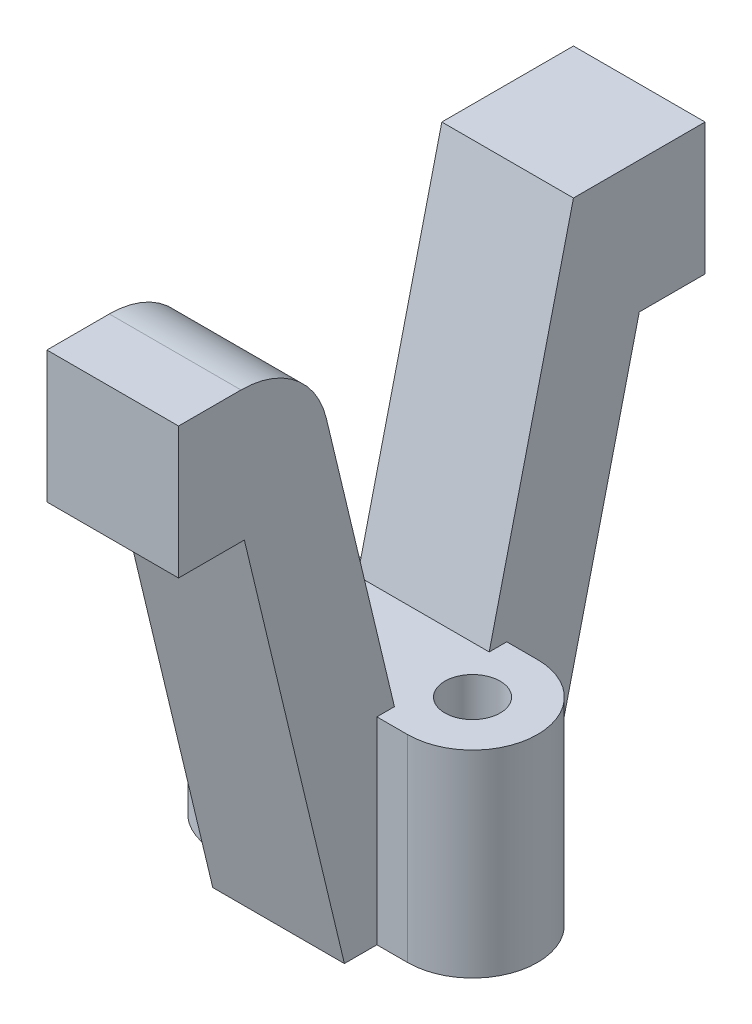
ISO-10303-21;
HEADER;
FILE_DESCRIPTION(('STEP AP214'),'2;1');
FILE_NAME('part.step','',(''),(''),'','','');
FILE_SCHEMA(('AUTOMOTIVE_DESIGN { 1 0 10303 214 1 1 1 1 }'));
ENDSEC;
DATA;
#1=APPLICATION_CONTEXT('core data for automotive mechanical design processes');
#2=APPLICATION_PROTOCOL_DEFINITION('international standard','automotive_design',2000,#1);
#3=PRODUCT_CONTEXT('',#1,'mechanical');
#4=PRODUCT('Part','Part','',(#3));
#5=PRODUCT_RELATED_PRODUCT_CATEGORY('part','',(#4));
#6=PRODUCT_DEFINITION_FORMATION('','',#4);
#7=PRODUCT_DEFINITION_CONTEXT('part definition',#1,'design');
#8=PRODUCT_DEFINITION('design','',#6,#7);
#9=PRODUCT_DEFINITION_SHAPE('','',#8);
#10=(LENGTH_UNIT() NAMED_UNIT(*) SI_UNIT(.MILLI.,.METRE.));
#11=(NAMED_UNIT(*) PLANE_ANGLE_UNIT() SI_UNIT($,.RADIAN.));
#12=(NAMED_UNIT(*) SI_UNIT($,.STERADIAN.) SOLID_ANGLE_UNIT());
#13=UNCERTAINTY_MEASURE_WITH_UNIT(LENGTH_MEASURE(1.E-05),#10,'distance_accuracy_value','');
#14=(GEOMETRIC_REPRESENTATION_CONTEXT(3) GLOBAL_UNCERTAINTY_ASSIGNED_CONTEXT((#13)) GLOBAL_UNIT_ASSIGNED_CONTEXT((#10,
#11,#12)) REPRESENTATION_CONTEXT('',''));
#15=CARTESIAN_POINT('',(0.,0.,0.));
#16=DIRECTION('',(0.,0.,1.));
#17=DIRECTION('',(1.,0.,0.));
#18=AXIS2_PLACEMENT_3D('',#15,#16,#17);
#19=CARTESIAN_POINT('',(-2.2,4.5,-1.48));
#20=DIRECTION('',(0.,0.,1.));
#21=DIRECTION('',(1.,0.,0.));
#22=AXIS2_PLACEMENT_3D('',#19,#20,#21);
#23=PLANE('',#22);
#24=DIRECTION('',(0.,-1.,0.));
#25=VECTOR('',#24,1.);
#26=CARTESIAN_POINT('',(1.5,4.5,-1.48));
#27=LINE('',#26,#25);
#28=CARTESIAN_POINT('',(1.5,4.5,-1.48));
#29=VERTEX_POINT('',#28);
#30=CARTESIAN_POINT('',(1.5,0.,-1.48));
#31=VERTEX_POINT('',#30);
#32=EDGE_CURVE('E341',#29,#31,#27,.T.);
#33=ORIENTED_EDGE('',*,*,#32,.F.);
#34=DIRECTION('',(-1.,0.,0.));
#35=VECTOR('',#34,1.);
#36=CARTESIAN_POINT('',(-2.2,4.5,-1.48));
#37=LINE('',#36,#35);
#38=CARTESIAN_POINT('',(2.2,4.5,-1.48));
#39=VERTEX_POINT('',#38);
#40=EDGE_CURVE('E254',#39,#29,#37,.T.);
#41=ORIENTED_EDGE('',*,*,#40,.F.);
#42=DIRECTION('',(0.,-1.,0.));
#43=VECTOR('',#42,1.);
#44=CARTESIAN_POINT('',(2.2,4.5,-1.48));
#45=LINE('',#44,#43);
#46=CARTESIAN_POINT('',(2.2,0.,-1.48));
#47=VERTEX_POINT('',#46);
#48=EDGE_CURVE('E269',#39,#47,#45,.T.);
#49=ORIENTED_EDGE('',*,*,#48,.T.);
#50=DIRECTION('',(-1.,0.,0.));
#51=VECTOR('',#50,1.);
#52=CARTESIAN_POINT('',(-2.2,0.,-1.48));
#53=LINE('',#52,#51);
#54=EDGE_CURVE('E247',#47,#31,#53,.T.);
#55=ORIENTED_EDGE('',*,*,#54,.T.);
#56=EDGE_LOOP('',(#33,#41,#49,#55));
#57=FACE_BOUND('',#56,.T.);
#58=ADVANCED_FACE('F33',(#57),#23,.F.);
#59=CARTESIAN_POINT('',(-1.5,12.5,6.));
#60=DIRECTION('',(0.,1.,0.));
#61=DIRECTION('',(0.,0.,1.));
#62=AXIS2_PLACEMENT_3D('',#59,#60,#61);
#63=PLANE('',#62);
#64=DIRECTION('',(0.,0.,1.));
#65=VECTOR('',#64,1.);
#66=CARTESIAN_POINT('',(1.5,12.5,6.));
#67=LINE('',#66,#65);
#68=CARTESIAN_POINT('',(1.5,12.5,4.57679362114919));
#69=VERTEX_POINT('',#68);
#70=CARTESIAN_POINT('',(1.5,12.5,6.));
#71=VERTEX_POINT('',#70);
#72=EDGE_CURVE('E286',#69,#71,#67,.T.);
#73=ORIENTED_EDGE('',*,*,#72,.F.);
#74=DIRECTION('',(1.,0.,0.));
#75=VECTOR('',#74,1.);
#76=CARTESIAN_POINT('',(-1.5,12.5,4.57679362114919));
#77=LINE('',#76,#75);
#78=CARTESIAN_POINT('',(-1.5,12.5,4.57679362114919));
#79=VERTEX_POINT('',#78);
#80=EDGE_CURVE('E331',#69,#79,#77,.F.);
#81=ORIENTED_EDGE('',*,*,#80,.T.);
#82=DIRECTION('',(0.,0.,1.));
#83=VECTOR('',#82,1.);
#84=CARTESIAN_POINT('',(-1.5,12.5,6.));
#85=LINE('',#84,#83);
#86=CARTESIAN_POINT('',(-1.5,12.5,6.));
#87=VERTEX_POINT('',#86);
#88=EDGE_CURVE('E301',#79,#87,#85,.T.);
#89=ORIENTED_EDGE('',*,*,#88,.T.);
#90=DIRECTION('',(1.,0.,0.));
#91=VECTOR('',#90,1.);
#92=CARTESIAN_POINT('',(-1.5,12.5,6.));
#93=LINE('',#92,#91);
#94=EDGE_CURVE('E317',#87,#71,#93,.T.);
#95=ORIENTED_EDGE('',*,*,#94,.T.);
#96=EDGE_LOOP('',(#73,#81,#89,#95));
#97=FACE_BOUND('',#96,.T.);
#98=ADVANCED_FACE('F399',(#97),#63,.T.);
#99=CARTESIAN_POINT('',(-1.5,12.5,3.));
#100=DIRECTION('',(0.,0.233372952475324,-0.972387301980517));
#101=DIRECTION('',(0.,0.972387301980518,0.233372952475324));
#102=AXIS2_PLACEMENT_3D('',#99,#100,#101);
#103=PLANE('',#102);
#104=DIRECTION('',(1.,0.,0.));
#105=VECTOR('',#104,1.);
#106=CARTESIAN_POINT('',(-1.5,4.5,1.08));
#107=LINE('',#106,#105);
#108=CARTESIAN_POINT('',(-1.5,4.5,1.08));
#109=VERTEX_POINT('',#108);
#110=CARTESIAN_POINT('',(1.5,4.5,1.08));
#111=VERTEX_POINT('',#110);
#112=EDGE_CURVE('E280',#109,#111,#107,.T.);
#113=ORIENTED_EDGE('',*,*,#112,.F.);
#114=DIRECTION('',(0.,0.972387301980517,0.233372952475324));
#115=VECTOR('',#114,1.);
#116=CARTESIAN_POINT('',(-1.5,12.5,3.));
#117=LINE('',#116,#115);
#118=CARTESIAN_POINT('',(-1.5,10.9667459049506,2.63201901718816));
#119=VERTEX_POINT('',#118);
#120=EDGE_CURVE('E315',#109,#119,#117,.T.);
#121=ORIENTED_EDGE('',*,*,#120,.T.);
#122=DIRECTION('',(1.,0.,0.));
#123=VECTOR('',#122,1.);
#124=CARTESIAN_POINT('',(-1.5,10.9667459049506,2.63201901718816));
#125=LINE('',#124,#123);
#126=CARTESIAN_POINT('',(1.5,10.9667459049506,2.63201901718816));
#127=VERTEX_POINT('',#126);
#128=EDGE_CURVE('E320',#119,#127,#125,.T.);
#129=ORIENTED_EDGE('',*,*,#128,.T.);
#130=DIRECTION('',(0.,0.972387301980517,0.233372952475324));
#131=VECTOR('',#130,1.);
#132=CARTESIAN_POINT('',(1.5,12.5,3.));
#133=LINE('',#132,#131);
#134=EDGE_CURVE('E299',#111,#127,#133,.T.);
#135=ORIENTED_EDGE('',*,*,#134,.F.);
#136=EDGE_LOOP('',(#113,#121,#129,#135));
#137=FACE_BOUND('',#136,.T.);
#138=ADVANCED_FACE('F386',(#137),#103,.T.);
#139=CARTESIAN_POINT('',(-1.5,0.,0.));
#140=DIRECTION('',(0.,-1.,0.));
#141=DIRECTION('',(0.,0.,-1.));
#142=AXIS2_PLACEMENT_3D('',#139,#140,#141);
#143=PLANE('',#142);
#144=CARTESIAN_POINT('',(-1.5,0.,-1.48));
#145=VERTEX_POINT('',#144);
#146=CARTESIAN_POINT('',(-2.2,0.,-1.48));
#147=VERTEX_POINT('',#146);
#148=EDGE_CURVE('E265',#145,#147,#53,.T.);
#149=ORIENTED_EDGE('',*,*,#148,.F.);
#150=DIRECTION('',(0.,0.,1.));
#151=VECTOR('',#150,1.);
#152=CARTESIAN_POINT('',(-1.5,0.,0.));
#153=LINE('',#152,#151);
#154=CARTESIAN_POINT('',(-1.5,0.,-2.22));
#155=VERTEX_POINT('',#154);
#156=EDGE_CURVE('E212',#155,#145,#153,.T.);
#157=ORIENTED_EDGE('',*,*,#156,.F.);
#158=DIRECTION('',(1.,0.,0.));
#159=VECTOR('',#158,1.);
#160=CARTESIAN_POINT('',(-1.5,0.,-2.22));
#161=LINE('',#160,#159);
#162=CARTESIAN_POINT('',(1.5,0.,-2.22));
#163=VERTEX_POINT('',#162);
#164=EDGE_CURVE('E191',#155,#163,#161,.T.);
#165=ORIENTED_EDGE('',*,*,#164,.T.);
#166=DIRECTION('',(0.,0.,1.));
#167=VECTOR('',#166,1.);
#168=CARTESIAN_POINT('',(1.5,0.,0.));
#169=LINE('',#168,#167);
#170=EDGE_CURVE('E181',#163,#31,#169,.T.);
#171=ORIENTED_EDGE('',*,*,#170,.T.);
#172=ORIENTED_EDGE('',*,*,#54,.F.);
#173=CARTESIAN_POINT('',(2.2,0.,0.));
#174=DIRECTION('',(0.,1.,0.));
#175=DIRECTION('',(0.,0.,1.));
#176=AXIS2_PLACEMENT_3D('',#173,#174,#175);
#177=CIRCLE('',#176,1.48);
#178=CARTESIAN_POINT('',(2.2,0.,1.48));
#179=VERTEX_POINT('',#178);
#180=EDGE_CURVE('E263',#179,#47,#177,.T.);
#181=ORIENTED_EDGE('',*,*,#180,.F.);
#182=DIRECTION('',(1.,0.,0.));
#183=VECTOR('',#182,1.);
#184=CARTESIAN_POINT('',(-2.2,0.,1.48));
#185=LINE('',#184,#183);
#186=CARTESIAN_POINT('',(1.5,0.,1.48));
#187=VERTEX_POINT('',#186);
#188=EDGE_CURVE('E259',#187,#179,#185,.T.);
#189=ORIENTED_EDGE('',*,*,#188,.F.);
#190=DIRECTION('',(0.,0.,-1.));
#191=VECTOR('',#190,1.);
#192=CARTESIAN_POINT('',(1.5,0.,0.));
#193=LINE('',#192,#191);
#194=CARTESIAN_POINT('',(1.5,0.,2.22));
#195=VERTEX_POINT('',#194);
#196=EDGE_CURVE('E297',#195,#187,#193,.T.);
#197=ORIENTED_EDGE('',*,*,#196,.F.);
#198=DIRECTION('',(1.,0.,0.));
#199=VECTOR('',#198,1.);
#200=CARTESIAN_POINT('',(-1.5,0.,2.22));
#201=LINE('',#200,#199);
#202=CARTESIAN_POINT('',(-1.5,0.,2.22));
#203=VERTEX_POINT('',#202);
#204=EDGE_CURVE('E318',#203,#195,#201,.T.);
#205=ORIENTED_EDGE('',*,*,#204,.F.);
#206=DIRECTION('',(0.,0.,-1.));
#207=VECTOR('',#206,1.);
#208=CARTESIAN_POINT('',(-1.5,0.,0.));
#209=LINE('',#208,#207);
#210=CARTESIAN_POINT('',(-1.5,0.,1.48));
#211=VERTEX_POINT('',#210);
#212=EDGE_CURVE('E312',#203,#211,#209,.T.);
#213=ORIENTED_EDGE('',*,*,#212,.T.);
#214=CARTESIAN_POINT('',(-2.2,0.,1.48));
#215=VERTEX_POINT('',#214);
#216=EDGE_CURVE('E260',#215,#211,#185,.T.);
#217=ORIENTED_EDGE('',*,*,#216,.F.);
#218=CARTESIAN_POINT('',(-2.2,0.,0.));
#219=DIRECTION('',(0.,1.,0.));
#220=DIRECTION('',(0.,0.,1.));
#221=AXIS2_PLACEMENT_3D('',#218,#219,#220);
#222=CIRCLE('',#221,1.48);
#223=EDGE_CURVE('E240',#147,#215,#222,.T.);
#224=ORIENTED_EDGE('',*,*,#223,.F.);
#225=EDGE_LOOP('',(#149,#157,#165,#171,#172,#181,#189,#197,#205,#213,#217,#224));
#226=FACE_BOUND('',#225,.T.);
#227=CARTESIAN_POINT('',(-2.2,0.,0.));
#228=DIRECTION('',(0.,1.,0.));
#229=DIRECTION('',(0.,0.,1.));
#230=AXIS2_PLACEMENT_3D('',#227,#228,#229);
#231=CIRCLE('',#230,0.63);
#232=CARTESIAN_POINT('',(-2.2,0.,0.63));
#233=VERTEX_POINT('',#232);
#234=EDGE_CURVE('E234',#233,#233,#231,.T.);
#235=ORIENTED_EDGE('',*,*,#234,.T.);
#236=EDGE_LOOP('',(#235));
#237=FACE_BOUND('',#236,.T.);
#238=CARTESIAN_POINT('',(2.2,0.,0.));
#239=DIRECTION('',(0.,1.,0.));
#240=DIRECTION('',(0.,0.,1.));
#241=AXIS2_PLACEMENT_3D('',#238,#239,#240);
#242=CIRCLE('',#241,0.63);
#243=CARTESIAN_POINT('',(2.2,0.,0.629999999999999));
#244=VERTEX_POINT('',#243);
#245=EDGE_CURVE('E230',#244,#244,#242,.T.);
#246=ORIENTED_EDGE('',*,*,#245,.T.);
#247=EDGE_LOOP('',(#246));
#248=FACE_BOUND('',#247,.T.);
#249=ADVANCED_FACE('F353',(#226,#237,#248),#143,.T.);
#250=CARTESIAN_POINT('',(-1.5,0.,2.22));
#251=DIRECTION('',(0.,-0.233372952475324,0.972387301980517));
#252=DIRECTION('',(0.,-0.972387301980518,-0.233372952475324));
#253=AXIS2_PLACEMENT_3D('',#250,#251,#252);
#254=PLANE('',#253);
#255=ORIENTED_EDGE('',*,*,#204,.T.);
#256=DIRECTION('',(0.,-0.972387301980517,-0.233372952475324));
#257=VECTOR('',#256,1.);
#258=CARTESIAN_POINT('',(1.5,0.,2.22));
#259=LINE('',#258,#257);
#260=CARTESIAN_POINT('',(1.5,9.5,4.5));
#261=VERTEX_POINT('',#260);
#262=EDGE_CURVE('E294',#261,#195,#259,.T.);
#263=ORIENTED_EDGE('',*,*,#262,.F.);
#264=DIRECTION('',(1.,0.,0.));
#265=VECTOR('',#264,1.);
#266=CARTESIAN_POINT('',(-1.5,9.5,4.5));
#267=LINE('',#266,#265);
#268=CARTESIAN_POINT('',(-1.5,9.5,4.5));
#269=VERTEX_POINT('',#268);
#270=EDGE_CURVE('E321',#269,#261,#267,.T.);
#271=ORIENTED_EDGE('',*,*,#270,.F.);
#272=DIRECTION('',(0.,-0.972387301980517,-0.233372952475324));
#273=VECTOR('',#272,1.);
#274=CARTESIAN_POINT('',(-1.5,0.,2.22));
#275=LINE('',#274,#273);
#276=EDGE_CURVE('E309',#269,#203,#275,.T.);
#277=ORIENTED_EDGE('',*,*,#276,.T.);
#278=EDGE_LOOP('',(#255,#263,#271,#277));
#279=FACE_BOUND('',#278,.T.);
#280=ADVANCED_FACE('F411',(#279),#254,.T.);
#281=CARTESIAN_POINT('',(-1.5,9.5,6.));
#282=DIRECTION('',(0.,-1.,0.));
#283=DIRECTION('',(0.,0.,-1.));
#284=AXIS2_PLACEMENT_3D('',#281,#282,#283);
#285=PLANE('',#284);
#286=ORIENTED_EDGE('',*,*,#270,.T.);
#287=DIRECTION('',(0.,0.,-1.));
#288=VECTOR('',#287,1.);
#289=CARTESIAN_POINT('',(1.5,9.5,6.));
#290=LINE('',#289,#288);
#291=CARTESIAN_POINT('',(1.5,9.5,6.));
#292=VERTEX_POINT('',#291);
#293=EDGE_CURVE('E291',#292,#261,#290,.T.);
#294=ORIENTED_EDGE('',*,*,#293,.F.);
#295=DIRECTION('',(1.,0.,0.));
#296=VECTOR('',#295,1.);
#297=CARTESIAN_POINT('',(-1.5,9.5,6.));
#298=LINE('',#297,#296);
#299=CARTESIAN_POINT('',(-1.5,9.5,6.));
#300=VERTEX_POINT('',#299);
#301=EDGE_CURVE('E323',#300,#292,#298,.T.);
#302=ORIENTED_EDGE('',*,*,#301,.F.);
#303=DIRECTION('',(0.,0.,-1.));
#304=VECTOR('',#303,1.);
#305=CARTESIAN_POINT('',(-1.5,9.5,6.));
#306=LINE('',#305,#304);
#307=EDGE_CURVE('E306',#300,#269,#306,.T.);
#308=ORIENTED_EDGE('',*,*,#307,.T.);
#309=EDGE_LOOP('',(#286,#294,#302,#308));
#310=FACE_BOUND('',#309,.T.);
#311=ADVANCED_FACE('F407',(#310),#285,.T.);
#312=CARTESIAN_POINT('',(-1.5,12.5,6.));
#313=DIRECTION('',(0.,0.,1.));
#314=DIRECTION('',(0.,-1.,0.));
#315=AXIS2_PLACEMENT_3D('',#312,#313,#314);
#316=PLANE('',#315);
#317=ORIENTED_EDGE('',*,*,#301,.T.);
#318=DIRECTION('',(0.,-1.,0.));
#319=VECTOR('',#318,1.);
#320=CARTESIAN_POINT('',(1.5,12.5,6.));
#321=LINE('',#320,#319);
#322=EDGE_CURVE('E288',#71,#292,#321,.T.);
#323=ORIENTED_EDGE('',*,*,#322,.F.);
#324=ORIENTED_EDGE('',*,*,#94,.F.);
#325=DIRECTION('',(0.,-1.,0.));
#326=VECTOR('',#325,1.);
#327=CARTESIAN_POINT('',(-1.5,12.5,6.));
#328=LINE('',#327,#326);
#329=EDGE_CURVE('E303',#87,#300,#328,.T.);
#330=ORIENTED_EDGE('',*,*,#329,.T.);
#331=EDGE_LOOP('',(#317,#323,#324,#330));
#332=FACE_BOUND('',#331,.T.);
#333=ADVANCED_FACE('F403',(#332),#316,.T.);
#334=CARTESIAN_POINT('',(-1.5,0.,0.));
#335=DIRECTION('',(-1.,0.,0.));
#336=DIRECTION('',(0.,0.,1.));
#337=AXIS2_PLACEMENT_3D('',#334,#335,#336);
#338=PLANE('',#337);
#339=DIRECTION('',(0.,0.,-1.));
#340=VECTOR('',#339,1.);
#341=CARTESIAN_POINT('',(-1.5,4.5,0.));
#342=LINE('',#341,#340);
#343=CARTESIAN_POINT('',(-1.5,4.5,1.48));
#344=VERTEX_POINT('',#343);
#345=EDGE_CURVE('E283',#344,#109,#342,.T.);
#346=ORIENTED_EDGE('',*,*,#345,.F.);
#347=DIRECTION('',(0.,-1.,0.));
#348=VECTOR('',#347,1.);
#349=CARTESIAN_POINT('',(-1.5,0.,1.48));
#350=LINE('',#349,#348);
#351=EDGE_CURVE('E278',#344,#211,#350,.T.);
#352=ORIENTED_EDGE('',*,*,#351,.T.);
#353=ORIENTED_EDGE('',*,*,#212,.F.);
#354=ORIENTED_EDGE('',*,*,#276,.F.);
#355=ORIENTED_EDGE('',*,*,#307,.F.);
#356=ORIENTED_EDGE('',*,*,#329,.F.);
#357=ORIENTED_EDGE('',*,*,#88,.F.);
#358=CARTESIAN_POINT('',(-1.5,10.5,4.57679362114919));
#359=DIRECTION('',(-1.,0.,0.));
#360=DIRECTION('',(0.,0.,1.));
#361=AXIS2_PLACEMENT_3D('',#358,#359,#360);
#362=CIRCLE('',#361,2.);
#363=EDGE_CURVE('E333',#79,#119,#362,.T.);
#364=ORIENTED_EDGE('',*,*,#363,.T.);
#365=ORIENTED_EDGE('',*,*,#120,.F.);
#366=EDGE_LOOP('',(#346,#352,#353,#354,#355,#356,#357,#364,#365));
#367=FACE_BOUND('',#366,.T.);
#368=ADVANCED_FACE('F388',(#367),#338,.T.);
#369=CARTESIAN_POINT('',(1.5,0.,0.));
#370=DIRECTION('',(-1.,0.,0.));
#371=DIRECTION('',(0.,0.,1.));
#372=AXIS2_PLACEMENT_3D('',#369,#370,#371);
#373=PLANE('',#372);
#374=DIRECTION('',(0.,-1.,0.));
#375=VECTOR('',#374,1.);
#376=CARTESIAN_POINT('',(1.5,0.,1.48));
#377=LINE('',#376,#375);
#378=CARTESIAN_POINT('',(1.5,4.5,1.48));
#379=VERTEX_POINT('',#378);
#380=EDGE_CURVE('E336',#379,#187,#377,.T.);
#381=ORIENTED_EDGE('',*,*,#380,.F.);
#382=DIRECTION('',(0.,0.,-1.));
#383=VECTOR('',#382,1.);
#384=CARTESIAN_POINT('',(1.5,4.5,0.));
#385=LINE('',#384,#383);
#386=EDGE_CURVE('E339',#379,#111,#385,.T.);
#387=ORIENTED_EDGE('',*,*,#386,.T.);
#388=ORIENTED_EDGE('',*,*,#134,.T.);
#389=CARTESIAN_POINT('',(1.5,10.5,4.57679362114919));
#390=DIRECTION('',(-1.,0.,0.));
#391=DIRECTION('',(0.,0.,1.));
#392=AXIS2_PLACEMENT_3D('',#389,#390,#391);
#393=CIRCLE('',#392,2.);
#394=EDGE_CURVE('E329',#127,#69,#393,.F.);
#395=ORIENTED_EDGE('',*,*,#394,.T.);
#396=ORIENTED_EDGE('',*,*,#72,.T.);
#397=ORIENTED_EDGE('',*,*,#322,.T.);
#398=ORIENTED_EDGE('',*,*,#293,.T.);
#399=ORIENTED_EDGE('',*,*,#262,.T.);
#400=ORIENTED_EDGE('',*,*,#196,.T.);
#401=EDGE_LOOP('',(#381,#387,#388,#395,#396,#397,#398,#399,#400));
#402=FACE_BOUND('',#401,.T.);
#403=ADVANCED_FACE('F382',(#402),#373,.F.);
#404=CARTESIAN_POINT('',(-1.5,10.5,4.57679362114919));
#405=DIRECTION('',(1.,0.,0.));
#406=DIRECTION('',(0.,0.,-1.));
#407=AXIS2_PLACEMENT_3D('',#404,#405,#406);
#408=CYLINDRICAL_SURFACE('',#407,2.);
#409=ORIENTED_EDGE('',*,*,#363,.F.);
#410=ORIENTED_EDGE('',*,*,#80,.F.);
#411=ORIENTED_EDGE('',*,*,#394,.F.);
#412=ORIENTED_EDGE('',*,*,#128,.F.);
#413=EDGE_LOOP('',(#409,#410,#411,#412));
#414=FACE_BOUND('',#413,.T.);
#415=ADVANCED_FACE('F35',(#414),#408,.T.);
#416=CARTESIAN_POINT('',(-2.2,4.5,1.48));
#417=DIRECTION('',(0.,0.,-1.));
#418=DIRECTION('',(-1.,0.,0.));
#419=AXIS2_PLACEMENT_3D('',#416,#417,#418);
#420=PLANE('',#419);
#421=DIRECTION('',(1.,0.,0.));
#422=VECTOR('',#421,1.);
#423=CARTESIAN_POINT('',(-2.2,4.5,1.48));
#424=LINE('',#423,#422);
#425=CARTESIAN_POINT('',(2.2,4.5,1.48));
#426=VERTEX_POINT('',#425);
#427=EDGE_CURVE('E246',#379,#426,#424,.T.);
#428=ORIENTED_EDGE('',*,*,#427,.F.);
#429=ORIENTED_EDGE('',*,*,#380,.T.);
#430=ORIENTED_EDGE('',*,*,#188,.T.);
#431=DIRECTION('',(0.,-1.,0.));
#432=VECTOR('',#431,1.);
#433=CARTESIAN_POINT('',(2.2,4.5,1.48));
#434=LINE('',#433,#432);
#435=EDGE_CURVE('E272',#426,#179,#434,.T.);
#436=ORIENTED_EDGE('',*,*,#435,.F.);
#437=EDGE_LOOP('',(#428,#429,#430,#436));
#438=FACE_BOUND('',#437,.T.);
#439=ADVANCED_FACE('F380',(#438),#420,.F.);
#440=CARTESIAN_POINT('',(-2.2,4.5,0.));
#441=DIRECTION('',(0.,1.,0.));
#442=DIRECTION('',(0.,0.,1.));
#443=AXIS2_PLACEMENT_3D('',#440,#441,#442);
#444=PLANE('',#443);
#445=DIRECTION('',(0.,0.,1.));
#446=VECTOR('',#445,1.);
#447=CARTESIAN_POINT('',(-1.5,4.5,0.));
#448=LINE('',#447,#446);
#449=CARTESIAN_POINT('',(-1.5,4.5,-1.48));
#450=VERTEX_POINT('',#449);
#451=CARTESIAN_POINT('',(-1.5,4.5,-1.08));
#452=VERTEX_POINT('',#451);
#453=EDGE_CURVE('E228',#450,#452,#448,.T.);
#454=ORIENTED_EDGE('',*,*,#453,.F.);
#455=CARTESIAN_POINT('',(-2.2,4.5,-1.48));
#456=VERTEX_POINT('',#455);
#457=EDGE_CURVE('E253',#450,#456,#37,.T.);
#458=ORIENTED_EDGE('',*,*,#457,.T.);
#459=CARTESIAN_POINT('',(-2.2,4.5,0.));
#460=DIRECTION('',(0.,1.,0.));
#461=DIRECTION('',(0.,0.,1.));
#462=AXIS2_PLACEMENT_3D('',#459,#460,#461);
#463=CIRCLE('',#462,1.48);
#464=CARTESIAN_POINT('',(-2.2,4.5,1.48));
#465=VERTEX_POINT('',#464);
#466=EDGE_CURVE('E243',#456,#465,#463,.T.);
#467=ORIENTED_EDGE('',*,*,#466,.T.);
#468=EDGE_CURVE('E248',#465,#344,#424,.T.);
#469=ORIENTED_EDGE('',*,*,#468,.T.);
#470=ORIENTED_EDGE('',*,*,#345,.T.);
#471=ORIENTED_EDGE('',*,*,#112,.T.);
#472=ORIENTED_EDGE('',*,*,#386,.F.);
#473=ORIENTED_EDGE('',*,*,#427,.T.);
#474=CARTESIAN_POINT('',(2.2,4.5,0.));
#475=DIRECTION('',(0.,1.,0.));
#476=DIRECTION('',(0.,0.,1.));
#477=AXIS2_PLACEMENT_3D('',#474,#475,#476);
#478=CIRCLE('',#477,1.48);
#479=EDGE_CURVE('E251',#426,#39,#478,.T.);
#480=ORIENTED_EDGE('',*,*,#479,.T.);
#481=ORIENTED_EDGE('',*,*,#40,.T.);
#482=DIRECTION('',(0.,0.,1.));
#483=VECTOR('',#482,1.);
#484=CARTESIAN_POINT('',(1.5,4.5,0.));
#485=LINE('',#484,#483);
#486=CARTESIAN_POINT('',(1.5,4.5,-1.08));
#487=VERTEX_POINT('',#486);
#488=EDGE_CURVE('E51',#29,#487,#485,.T.);
#489=ORIENTED_EDGE('',*,*,#488,.T.);
#490=DIRECTION('',(-1.,0.,0.));
#491=VECTOR('',#490,1.);
#492=CARTESIAN_POINT('',(-2.2,4.5,-1.08));
#493=LINE('',#492,#491);
#494=EDGE_CURVE('E11',#487,#452,#493,.T.);
#495=ORIENTED_EDGE('',*,*,#494,.T.);
#496=EDGE_LOOP('',(#454,#458,#467,#469,#470,#471,#472,#473,#480,#481,#489,#495));
#497=FACE_BOUND('',#496,.T.);
#498=CARTESIAN_POINT('',(-2.2,4.5,0.));
#499=DIRECTION('',(0.,1.,0.));
#500=DIRECTION('',(0.,0.,1.));
#501=AXIS2_PLACEMENT_3D('',#498,#499,#500);
#502=CIRCLE('',#501,0.63);
#503=CARTESIAN_POINT('',(-2.2,4.5,0.63));
#504=VERTEX_POINT('',#503);
#505=EDGE_CURVE('E237',#504,#504,#502,.T.);
#506=ORIENTED_EDGE('',*,*,#505,.F.);
#507=EDGE_LOOP('',(#506));
#508=FACE_BOUND('',#507,.T.);
#509=CARTESIAN_POINT('',(2.2,4.5,0.));
#510=DIRECTION('',(0.,1.,0.));
#511=DIRECTION('',(0.,0.,1.));
#512=AXIS2_PLACEMENT_3D('',#509,#510,#511);
#513=CIRCLE('',#512,0.63);
#514=CARTESIAN_POINT('',(2.2,4.5,0.629999999999999));
#515=VERTEX_POINT('',#514);
#516=EDGE_CURVE('E231',#515,#515,#513,.T.);
#517=ORIENTED_EDGE('',*,*,#516,.F.);
#518=EDGE_LOOP('',(#517));
#519=FACE_BOUND('',#518,.T.);
#520=ADVANCED_FACE('F367',(#497,#508,#519),#444,.T.);
#521=CARTESIAN_POINT('',(-2.2,4.5,0.));
#522=DIRECTION('',(0.,-1.,0.));
#523=DIRECTION('',(0.,0.,-1.));
#524=AXIS2_PLACEMENT_3D('',#521,#522,#523);
#525=CYLINDRICAL_SURFACE('',#524,1.48);
#526=ORIENTED_EDGE('',*,*,#223,.T.);
#527=DIRECTION('',(0.,-1.,0.));
#528=VECTOR('',#527,1.);
#529=CARTESIAN_POINT('',(-2.2,4.5,1.48));
#530=LINE('',#529,#528);
#531=EDGE_CURVE('E275',#465,#215,#530,.T.);
#532=ORIENTED_EDGE('',*,*,#531,.F.);
#533=ORIENTED_EDGE('',*,*,#466,.F.);
#534=DIRECTION('',(0.,-1.,0.));
#535=VECTOR('',#534,1.);
#536=CARTESIAN_POINT('',(-2.2,4.5,-1.48));
#537=LINE('',#536,#535);
#538=EDGE_CURVE('E256',#456,#147,#537,.T.);
#539=ORIENTED_EDGE('',*,*,#538,.T.);
#540=EDGE_LOOP('',(#526,#532,#533,#539));
#541=FACE_BOUND('',#540,.T.);
#542=ADVANCED_FACE('F418',(#541),#525,.T.);
#543=ORIENTED_EDGE('',*,*,#351,.F.);
#544=ORIENTED_EDGE('',*,*,#468,.F.);
#545=ORIENTED_EDGE('',*,*,#531,.T.);
#546=ORIENTED_EDGE('',*,*,#216,.T.);
#547=EDGE_LOOP('',(#543,#544,#545,#546));
#548=FACE_BOUND('',#547,.T.);
#549=ADVANCED_FACE('F414',(#548),#420,.F.);
#550=CARTESIAN_POINT('',(2.2,4.5,0.));
#551=DIRECTION('',(0.,-1.,0.));
#552=DIRECTION('',(0.,0.,-1.));
#553=AXIS2_PLACEMENT_3D('',#550,#551,#552);
#554=CYLINDRICAL_SURFACE('',#553,1.48);
#555=ORIENTED_EDGE('',*,*,#180,.T.);
#556=ORIENTED_EDGE('',*,*,#48,.F.);
#557=ORIENTED_EDGE('',*,*,#479,.F.);
#558=ORIENTED_EDGE('',*,*,#435,.T.);
#559=EDGE_LOOP('',(#555,#556,#557,#558));
#560=FACE_BOUND('',#559,.T.);
#561=ADVANCED_FACE('F375',(#560),#554,.T.);
#562=ORIENTED_EDGE('',*,*,#457,.F.);
#563=DIRECTION('',(0.,-1.,0.));
#564=VECTOR('',#563,1.);
#565=CARTESIAN_POINT('',(-1.5,4.5,-1.48));
#566=LINE('',#565,#564);
#567=EDGE_CURVE('E41',#450,#145,#566,.T.);
#568=ORIENTED_EDGE('',*,*,#567,.T.);
#569=ORIENTED_EDGE('',*,*,#148,.T.);
#570=ORIENTED_EDGE('',*,*,#538,.F.);
#571=EDGE_LOOP('',(#562,#568,#569,#570));
#572=FACE_BOUND('',#571,.T.);
#573=ADVANCED_FACE('F347',(#572),#23,.F.);
#574=CARTESIAN_POINT('',(-2.2,4.5,0.));
#575=DIRECTION('',(0.,-1.,0.));
#576=DIRECTION('',(0.,0.,-1.));
#577=AXIS2_PLACEMENT_3D('',#574,#575,#576);
#578=CYLINDRICAL_SURFACE('',#577,0.63);
#579=ORIENTED_EDGE('',*,*,#505,.T.);
#580=EDGE_LOOP('',(#579));
#581=FACE_BOUND('',#580,.T.);
#582=ORIENTED_EDGE('',*,*,#234,.F.);
#583=EDGE_LOOP('',(#582));
#584=FACE_BOUND('',#583,.T.);
#585=ADVANCED_FACE('F440',(#581,#584),#578,.F.);
#586=CARTESIAN_POINT('',(2.2,4.5,0.));
#587=DIRECTION('',(0.,-1.,0.));
#588=DIRECTION('',(0.,0.,-1.));
#589=AXIS2_PLACEMENT_3D('',#586,#587,#588);
#590=CYLINDRICAL_SURFACE('',#589,0.63);
#591=ORIENTED_EDGE('',*,*,#516,.T.);
#592=EDGE_LOOP('',(#591));
#593=FACE_BOUND('',#592,.T.);
#594=ORIENTED_EDGE('',*,*,#245,.F.);
#595=EDGE_LOOP('',(#594));
#596=FACE_BOUND('',#595,.T.);
#597=ADVANCED_FACE('F445',(#593,#596),#590,.F.);
#598=CARTESIAN_POINT('',(-1.5,12.5,-6.));
#599=DIRECTION('',(0.,-1.,0.));
#600=DIRECTION('',(0.,0.,-1.));
#601=AXIS2_PLACEMENT_3D('',#598,#599,#600);
#602=PLANE('',#601);
#603=DIRECTION('',(1.,0.,0.));
#604=VECTOR('',#603,1.);
#605=CARTESIAN_POINT('',(-1.5,12.5,-3.));
#606=LINE('',#605,#604);
#607=CARTESIAN_POINT('',(-1.5,12.5,-3.));
#608=VERTEX_POINT('',#607);
#609=CARTESIAN_POINT('',(1.5,12.5,-3.));
#610=VERTEX_POINT('',#609);
#611=EDGE_CURVE('E177',#608,#610,#606,.T.);
#612=ORIENTED_EDGE('',*,*,#611,.T.);
#613=DIRECTION('',(0.,0.,-1.));
#614=VECTOR('',#613,1.);
#615=CARTESIAN_POINT('',(1.5,12.5,-6.));
#616=LINE('',#615,#614);
#617=CARTESIAN_POINT('',(1.5,12.5,-6.));
#618=VERTEX_POINT('',#617);
#619=EDGE_CURVE('E182',#610,#618,#616,.T.);
#620=ORIENTED_EDGE('',*,*,#619,.T.);
#621=DIRECTION('',(1.,0.,0.));
#622=VECTOR('',#621,1.);
#623=CARTESIAN_POINT('',(-1.5,12.5,-6.));
#624=LINE('',#623,#622);
#625=CARTESIAN_POINT('',(-1.5,12.5,-6.));
#626=VERTEX_POINT('',#625);
#627=EDGE_CURVE('E220',#626,#618,#624,.T.);
#628=ORIENTED_EDGE('',*,*,#627,.F.);
#629=DIRECTION('',(0.,0.,-1.));
#630=VECTOR('',#629,1.);
#631=CARTESIAN_POINT('',(-1.5,12.5,-6.));
#632=LINE('',#631,#630);
#633=EDGE_CURVE('E190',#608,#626,#632,.T.);
#634=ORIENTED_EDGE('',*,*,#633,.F.);
#635=EDGE_LOOP('',(#612,#620,#628,#634));
#636=FACE_BOUND('',#635,.T.);
#637=ADVANCED_FACE('F186',(#636),#602,.F.);
#638=CARTESIAN_POINT('',(-1.5,12.5,-6.));
#639=DIRECTION('',(0.,0.,1.));
#640=DIRECTION('',(0.,-1.,0.));
#641=AXIS2_PLACEMENT_3D('',#638,#639,#640);
#642=PLANE('',#641);
#643=ORIENTED_EDGE('',*,*,#627,.T.);
#644=DIRECTION('',(0.,-1.,0.));
#645=VECTOR('',#644,1.);
#646=CARTESIAN_POINT('',(1.5,12.5,-6.));
#647=LINE('',#646,#645);
#648=CARTESIAN_POINT('',(1.5,9.5,-6.));
#649=VERTEX_POINT('',#648);
#650=EDGE_CURVE('E197',#618,#649,#647,.T.);
#651=ORIENTED_EDGE('',*,*,#650,.T.);
#652=DIRECTION('',(1.,0.,0.));
#653=VECTOR('',#652,1.);
#654=CARTESIAN_POINT('',(-1.5,9.5,-6.));
#655=LINE('',#654,#653);
#656=CARTESIAN_POINT('',(-1.5,9.5,-6.));
#657=VERTEX_POINT('',#656);
#658=EDGE_CURVE('E222',#657,#649,#655,.T.);
#659=ORIENTED_EDGE('',*,*,#658,.F.);
#660=DIRECTION('',(0.,-1.,0.));
#661=VECTOR('',#660,1.);
#662=CARTESIAN_POINT('',(-1.5,12.5,-6.));
#663=LINE('',#662,#661);
#664=EDGE_CURVE('E192',#626,#657,#663,.T.);
#665=ORIENTED_EDGE('',*,*,#664,.F.);
#666=EDGE_LOOP('',(#643,#651,#659,#665));
#667=FACE_BOUND('',#666,.T.);
#668=ADVANCED_FACE('F421',(#667),#642,.F.);
#669=CARTESIAN_POINT('',(-1.5,9.5,-6.));
#670=DIRECTION('',(0.,1.,0.));
#671=DIRECTION('',(0.,0.,1.));
#672=AXIS2_PLACEMENT_3D('',#669,#670,#671);
#673=PLANE('',#672);
#674=ORIENTED_EDGE('',*,*,#658,.T.);
#675=DIRECTION('',(0.,0.,1.));
#676=VECTOR('',#675,1.);
#677=CARTESIAN_POINT('',(1.5,9.5,-6.));
#678=LINE('',#677,#676);
#679=CARTESIAN_POINT('',(1.5,9.5,-4.5));
#680=VERTEX_POINT('',#679);
#681=EDGE_CURVE('E205',#649,#680,#678,.T.);
#682=ORIENTED_EDGE('',*,*,#681,.T.);
#683=DIRECTION('',(1.,0.,0.));
#684=VECTOR('',#683,1.);
#685=CARTESIAN_POINT('',(-1.5,9.5,-4.5));
#686=LINE('',#685,#684);
#687=CARTESIAN_POINT('',(-1.5,9.5,-4.5));
#688=VERTEX_POINT('',#687);
#689=EDGE_CURVE('E224',#688,#680,#686,.T.);
#690=ORIENTED_EDGE('',*,*,#689,.F.);
#691=DIRECTION('',(0.,0.,1.));
#692=VECTOR('',#691,1.);
#693=CARTESIAN_POINT('',(-1.5,9.5,-6.));
#694=LINE('',#693,#692);
#695=EDGE_CURVE('E217',#657,#688,#694,.T.);
#696=ORIENTED_EDGE('',*,*,#695,.F.);
#697=EDGE_LOOP('',(#674,#682,#690,#696));
#698=FACE_BOUND('',#697,.T.);
#699=ADVANCED_FACE('F423',(#698),#673,.F.);
#700=CARTESIAN_POINT('',(-1.5,0.,-2.22));
#701=DIRECTION('',(0.,0.233372952475324,0.972387301980517));
#702=DIRECTION('',(0.,-0.972387301980518,0.233372952475324));
#703=AXIS2_PLACEMENT_3D('',#700,#701,#702);
#704=PLANE('',#703);
#705=ORIENTED_EDGE('',*,*,#689,.T.);
#706=DIRECTION('',(0.,-0.972387301980517,0.233372952475324));
#707=VECTOR('',#706,1.);
#708=CARTESIAN_POINT('',(1.5,0.,-2.22));
#709=LINE('',#708,#707);
#710=EDGE_CURVE('E202',#680,#163,#709,.T.);
#711=ORIENTED_EDGE('',*,*,#710,.T.);
#712=ORIENTED_EDGE('',*,*,#164,.F.);
#713=DIRECTION('',(0.,-0.972387301980517,0.233372952475324));
#714=VECTOR('',#713,1.);
#715=CARTESIAN_POINT('',(-1.5,0.,-2.22));
#716=LINE('',#715,#714);
#717=EDGE_CURVE('E215',#688,#155,#716,.T.);
#718=ORIENTED_EDGE('',*,*,#717,.F.);
#719=EDGE_LOOP('',(#705,#711,#712,#718));
#720=FACE_BOUND('',#719,.T.);
#721=ADVANCED_FACE('F361',(#720),#704,.F.);
#722=CARTESIAN_POINT('',(-1.5,12.5,-3.));
#723=DIRECTION('',(0.,-0.233372952475324,-0.972387301980517));
#724=DIRECTION('',(0.,0.972387301980518,-0.233372952475324));
#725=AXIS2_PLACEMENT_3D('',#722,#723,#724);
#726=PLANE('',#725);
#727=ORIENTED_EDGE('',*,*,#494,.F.);
#728=DIRECTION('',(0.,0.972387301980517,-0.233372952475324));
#729=VECTOR('',#728,1.);
#730=CARTESIAN_POINT('',(1.5,12.5,-3.));
#731=LINE('',#730,#729);
#732=EDGE_CURVE('E173',#487,#610,#731,.T.);
#733=ORIENTED_EDGE('',*,*,#732,.T.);
#734=ORIENTED_EDGE('',*,*,#611,.F.);
#735=DIRECTION('',(0.,0.972387301980517,-0.233372952475324));
#736=VECTOR('',#735,1.);
#737=CARTESIAN_POINT('',(-1.5,12.5,-3.));
#738=LINE('',#737,#736);
#739=EDGE_CURVE('E210',#452,#608,#738,.T.);
#740=ORIENTED_EDGE('',*,*,#739,.F.);
#741=EDGE_LOOP('',(#727,#733,#734,#740));
#742=FACE_BOUND('',#741,.T.);
#743=ADVANCED_FACE('F175',(#742),#726,.F.);
#744=CARTESIAN_POINT('',(-1.5,0.,0.));
#745=DIRECTION('',(-1.,0.,0.));
#746=DIRECTION('',(0.,0.,-1.));
#747=AXIS2_PLACEMENT_3D('',#744,#745,#746);
#748=PLANE('',#747);
#749=ORIENTED_EDGE('',*,*,#567,.F.);
#750=ORIENTED_EDGE('',*,*,#453,.T.);
#751=ORIENTED_EDGE('',*,*,#739,.T.);
#752=ORIENTED_EDGE('',*,*,#633,.T.);
#753=ORIENTED_EDGE('',*,*,#664,.T.);
#754=ORIENTED_EDGE('',*,*,#695,.T.);
#755=ORIENTED_EDGE('',*,*,#717,.T.);
#756=ORIENTED_EDGE('',*,*,#156,.T.);
#757=EDGE_LOOP('',(#749,#750,#751,#752,#753,#754,#755,#756));
#758=FACE_BOUND('',#757,.T.);
#759=ADVANCED_FACE('F355',(#758),#748,.T.);
#760=CARTESIAN_POINT('',(1.5,0.,0.));
#761=DIRECTION('',(-1.,0.,0.));
#762=DIRECTION('',(0.,0.,-1.));
#763=AXIS2_PLACEMENT_3D('',#760,#761,#762);
#764=PLANE('',#763);
#765=ORIENTED_EDGE('',*,*,#488,.F.);
#766=ORIENTED_EDGE('',*,*,#32,.T.);
#767=ORIENTED_EDGE('',*,*,#170,.F.);
#768=ORIENTED_EDGE('',*,*,#710,.F.);
#769=ORIENTED_EDGE('',*,*,#681,.F.);
#770=ORIENTED_EDGE('',*,*,#650,.F.);
#771=ORIENTED_EDGE('',*,*,#619,.F.);
#772=ORIENTED_EDGE('',*,*,#732,.F.);
#773=EDGE_LOOP('',(#765,#766,#767,#768,#769,#770,#771,#772));
#774=FACE_BOUND('',#773,.T.);
#775=ADVANCED_FACE('F194',(#774),#764,.F.);
#776=CLOSED_SHELL('',(#58,#98,#138,#249,#280,#311,#333,#368,#403,#415,#439,#520,#542,#549,#561,
#573,#585,#597,#637,#668,#699,#721,#743,#759,#775));
#777=MANIFOLD_SOLID_BREP('B2',#776);
#778=ADVANCED_BREP_SHAPE_REPRESENTATION('',(#18,#777),#14);
#779=SHAPE_DEFINITION_REPRESENTATION(#9,#778);
ENDSEC;
END-ISO-10303-21;
